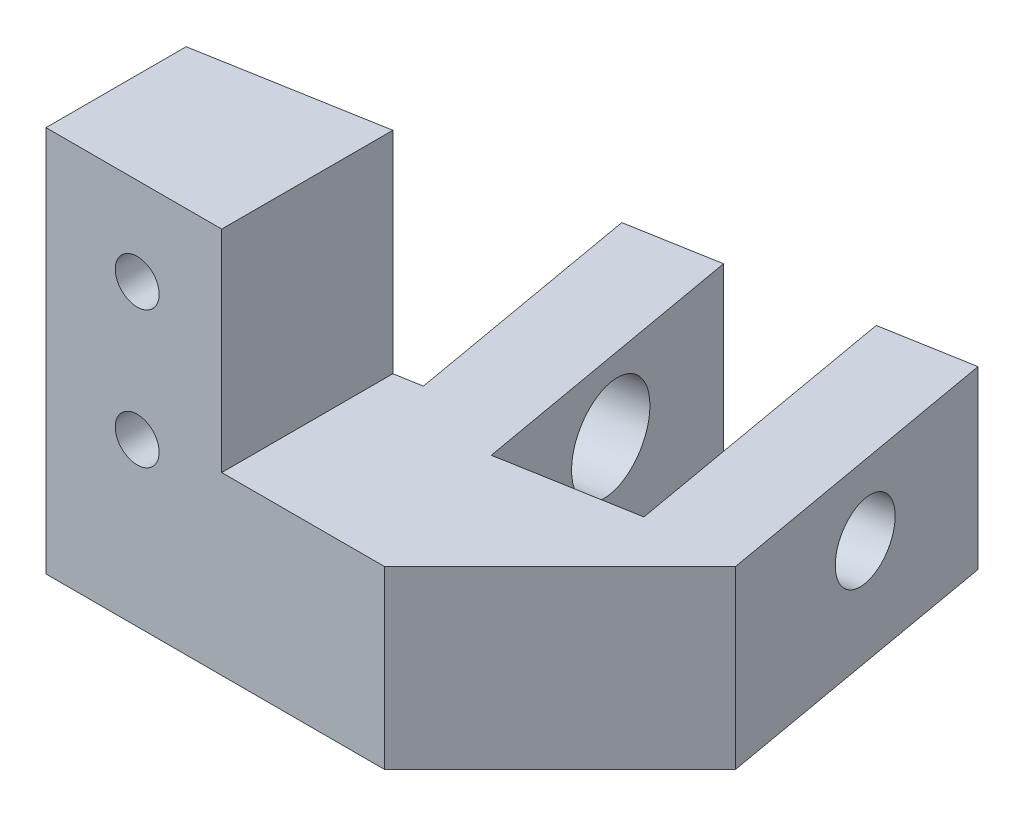
ISO-10303-21;
HEADER;
FILE_DESCRIPTION(('STEP AP214'),'2;1');
FILE_NAME('part.step','',(''),(''),'','','');
FILE_SCHEMA(('AUTOMOTIVE_DESIGN { 1 0 10303 214 1 1 1 1 }'));
ENDSEC;
DATA;
#1=APPLICATION_CONTEXT('core data for automotive mechanical design processes');
#2=APPLICATION_PROTOCOL_DEFINITION('international standard','automotive_design',2000,#1);
#3=PRODUCT_CONTEXT('',#1,'mechanical');
#4=PRODUCT('Part','Part','',(#3));
#5=PRODUCT_RELATED_PRODUCT_CATEGORY('part','',(#4));
#6=PRODUCT_DEFINITION_FORMATION('','',#4);
#7=PRODUCT_DEFINITION_CONTEXT('part definition',#1,'design');
#8=PRODUCT_DEFINITION('design','',#6,#7);
#9=PRODUCT_DEFINITION_SHAPE('','',#8);
#10=(LENGTH_UNIT() NAMED_UNIT(*) SI_UNIT(.MILLI.,.METRE.));
#11=(NAMED_UNIT(*) PLANE_ANGLE_UNIT() SI_UNIT($,.RADIAN.));
#12=(NAMED_UNIT(*) SI_UNIT($,.STERADIAN.) SOLID_ANGLE_UNIT());
#13=UNCERTAINTY_MEASURE_WITH_UNIT(LENGTH_MEASURE(1.E-05),#10,'distance_accuracy_value','');
#14=(GEOMETRIC_REPRESENTATION_CONTEXT(3) GLOBAL_UNCERTAINTY_ASSIGNED_CONTEXT((#13)) GLOBAL_UNIT_ASSIGNED_CONTEXT((#10,
#11,#12)) REPRESENTATION_CONTEXT('',''));
#15=CARTESIAN_POINT('',(0.,0.,0.));
#16=DIRECTION('',(0.,0.,1.));
#17=DIRECTION('',(1.,0.,0.));
#18=AXIS2_PLACEMENT_3D('',#15,#16,#17);
#19=CARTESIAN_POINT('',(0.,22.,10.));
#20=DIRECTION('',(1.,0.,0.));
#21=DIRECTION('',(0.,0.,-1.));
#22=AXIS2_PLACEMENT_3D('',#19,#20,#21);
#23=PLANE('',#22);
#24=DIRECTION('',(0.,0.,-1.));
#25=VECTOR('',#24,1.);
#26=CARTESIAN_POINT('',(0.,22.,10.));
#27=LINE('',#26,#25);
#28=CARTESIAN_POINT('',(0.,22.,10.));
#29=VERTEX_POINT('',#28);
#30=CARTESIAN_POINT('',(0.,22.,2.02423978513792));
#31=VERTEX_POINT('',#30);
#32=EDGE_CURVE('E157',#29,#31,#27,.T.);
#33=ORIENTED_EDGE('',*,*,#32,.T.);
#34=DIRECTION('',(0.,1.,0.));
#35=VECTOR('',#34,1.);
#36=CARTESIAN_POINT('',(0.,-0.00100000000001141,2.02423978513792));
#37=LINE('',#36,#35);
#38=CARTESIAN_POINT('',(0.,0.,2.02423978513793));
#39=VERTEX_POINT('',#38);
#40=EDGE_CURVE('E138',#39,#31,#37,.T.);
#41=ORIENTED_EDGE('',*,*,#40,.F.);
#42=DIRECTION('',(0.,0.,-1.));
#43=VECTOR('',#42,1.);
#44=CARTESIAN_POINT('',(0.,0.,10.));
#45=LINE('',#44,#43);
#46=CARTESIAN_POINT('',(0.,0.,10.));
#47=VERTEX_POINT('',#46);
#48=EDGE_CURVE('E159',#47,#39,#45,.T.);
#49=ORIENTED_EDGE('',*,*,#48,.F.);
#50=DIRECTION('',(0.,-1.,0.));
#51=VECTOR('',#50,1.);
#52=CARTESIAN_POINT('',(0.,22.,10.));
#53=LINE('',#52,#51);
#54=EDGE_CURVE('E187',#29,#47,#53,.T.);
#55=ORIENTED_EDGE('',*,*,#54,.F.);
#56=EDGE_LOOP('',(#33,#41,#49,#55));
#57=FACE_BOUND('',#56,.T.);
#58=ADVANCED_FACE('F39',(#57),#23,.F.);
#59=CARTESIAN_POINT('',(0.,0.,10.));
#60=DIRECTION('',(0.,1.,0.));
#61=DIRECTION('',(0.,0.,1.));
#62=AXIS2_PLACEMENT_3D('',#59,#60,#61);
#63=PLANE('',#62);
#64=ORIENTED_EDGE('',*,*,#48,.T.);
#65=DIRECTION('',(-0.984807753012208,0.,0.173648177666932));
#66=VECTOR('',#65,1.);
#67=CARTESIAN_POINT('',(11.4800342919995,0.,0.));
#68=LINE('',#67,#66);
#69=CARTESIAN_POINT('',(11.4800342919995,0.,0.));
#70=VERTEX_POINT('',#69);
#71=EDGE_CURVE('E251',#70,#39,#68,.T.);
#72=ORIENTED_EDGE('',*,*,#71,.F.);
#73=DIRECTION('',(-0.173648177666931,0.,-0.984807753012208));
#74=VECTOR('',#73,1.);
#75=CARTESIAN_POINT('',(9.06384530194854,0.,-13.7028886920363));
#76=LINE('',#75,#74);
#77=CARTESIAN_POINT('',(9.06384530194854,0.,-13.7028886920363));
#78=VERTEX_POINT('',#77);
#79=EDGE_CURVE('E210',#70,#78,#76,.T.);
#80=ORIENTED_EDGE('',*,*,#79,.T.);
#81=DIRECTION('',(0.984807753012208,0.,-0.173648177666931));
#82=VECTOR('',#81,1.);
#83=CARTESIAN_POINT('',(13.9878840670096,0.,-14.5711295803709));
#84=LINE('',#83,#82);
#85=CARTESIAN_POINT('',(13.9878840670096,0.,-14.5711295803709));
#86=VERTEX_POINT('',#85);
#87=EDGE_CURVE('E219',#78,#86,#84,.T.);
#88=ORIENTED_EDGE('',*,*,#87,.T.);
#89=DIRECTION('',(0.173648177666931,0.,0.984807753012208));
#90=VECTOR('',#89,1.);
#91=CARTESIAN_POINT('',(16.5571673514282,0.,0.));
#92=LINE('',#91,#90);
#93=CARTESIAN_POINT('',(16.8176396179286,0.,1.47721162951831));
#94=VERTEX_POINT('',#93);
#95=EDGE_CURVE('E185',#86,#94,#92,.T.);
#96=ORIENTED_EDGE('',*,*,#95,.T.);
#97=DIRECTION('',(-0.984807753012208,0.,0.173648177666931));
#98=VECTOR('',#97,1.);
#99=CARTESIAN_POINT('',(16.8176396179286,0.,1.47721162951831));
#100=LINE('',#99,#98);
#101=CARTESIAN_POINT('',(24.2036977655201,0.,0.174850297016328));
#102=VERTEX_POINT('',#101);
#103=EDGE_CURVE('E238',#102,#94,#100,.T.);
#104=ORIENTED_EDGE('',*,*,#103,.F.);
#105=DIRECTION('',(-0.173648177666931,0.,-0.984807753012208));
#106=VECTOR('',#105,1.);
#107=CARTESIAN_POINT('',(21.3739422146011,0.,-15.8734909128729));
#108=LINE('',#107,#106);
#109=CARTESIAN_POINT('',(21.3739422146011,0.,-15.8734909128729));
#110=VERTEX_POINT('',#109);
#111=EDGE_CURVE('E192',#102,#110,#108,.T.);
#112=ORIENTED_EDGE('',*,*,#111,.T.);
#113=DIRECTION('',(0.984807753012208,0.,-0.17364817766693));
#114=VECTOR('',#113,1.);
#115=CARTESIAN_POINT('',(26.2979809796622,0.,-16.7417318012075));
#116=LINE('',#115,#114);
#117=CARTESIAN_POINT('',(26.2979809796622,0.,-16.7417318012075));
#118=VERTEX_POINT('',#117);
#119=EDGE_CURVE('E204',#110,#118,#116,.T.);
#120=ORIENTED_EDGE('',*,*,#119,.T.);
#121=DIRECTION('',(0.173648177666931,0.,0.984807753012208));
#122=VECTOR('',#121,1.);
#123=CARTESIAN_POINT('',(29.25,0.,0.));
#124=LINE('',#123,#122);
#125=CARTESIAN_POINT('',(29.25,0.,0.));
#126=VERTEX_POINT('',#125);
#127=EDGE_CURVE('E188',#118,#126,#124,.T.);
#128=ORIENTED_EDGE('',*,*,#127,.T.);
#129=DIRECTION('',(-0.707106781186546,0.,0.707106781186549));
#130=VECTOR('',#129,1.);
#131=CARTESIAN_POINT('',(19.25,0.,10.));
#132=LINE('',#131,#130);
#133=CARTESIAN_POINT('',(19.25,0.,10.));
#134=VERTEX_POINT('',#133);
#135=EDGE_CURVE('E11',#126,#134,#132,.T.);
#136=ORIENTED_EDGE('',*,*,#135,.T.);
#137=DIRECTION('',(1.,0.,0.));
#138=VECTOR('',#137,1.);
#139=CARTESIAN_POINT('',(0.,0.,10.));
#140=LINE('',#139,#138);
#141=EDGE_CURVE('E190',#47,#134,#140,.T.);
#142=ORIENTED_EDGE('',*,*,#141,.F.);
#143=EDGE_LOOP('',(#64,#72,#80,#88,#96,#104,#112,#120,#128,#136,#142));
#144=FACE_BOUND('',#143,.T.);
#145=ADVANCED_FACE('F282',(#144),#63,.F.);
#146=CARTESIAN_POINT('',(29.25,10.,10.));
#147=DIRECTION('',(0.,-1.,0.));
#148=DIRECTION('',(1.,0.,0.));
#149=AXIS2_PLACEMENT_3D('',#146,#147,#148);
#150=PLANE('',#149);
#151=DIRECTION('',(0.173648177666931,0.,0.984807753012208));
#152=VECTOR('',#151,1.);
#153=CARTESIAN_POINT('',(9.06384530194854,10.,-13.7028886920363));
#154=LINE('',#153,#152);
#155=CARTESIAN_POINT('',(9.06384530194854,10.,-13.7028886920363));
#156=VERTEX_POINT('',#155);
#157=CARTESIAN_POINT('',(11.4800342919995,10.,0.));
#158=VERTEX_POINT('',#157);
#159=EDGE_CURVE('E214',#156,#158,#154,.T.);
#160=ORIENTED_EDGE('',*,*,#159,.T.);
#161=DIRECTION('',(0.984807753012208,0.,-0.173648177666932));
#162=VECTOR('',#161,1.);
#163=CARTESIAN_POINT('',(11.4800342919995,10.,0.));
#164=LINE('',#163,#162);
#165=CARTESIAN_POINT('',(10.,10.,0.26096997805326));
#166=VERTEX_POINT('',#165);
#167=EDGE_CURVE('E255',#166,#158,#164,.T.);
#168=ORIENTED_EDGE('',*,*,#167,.F.);
#169=DIRECTION('',(0.,0.,-1.));
#170=VECTOR('',#169,1.);
#171=CARTESIAN_POINT('',(10.,10.,10.));
#172=LINE('',#171,#170);
#173=CARTESIAN_POINT('',(10.,10.,10.));
#174=VERTEX_POINT('',#173);
#175=EDGE_CURVE('E152',#174,#166,#172,.T.);
#176=ORIENTED_EDGE('',*,*,#175,.F.);
#177=DIRECTION('',(-1.,0.,0.));
#178=VECTOR('',#177,1.);
#179=CARTESIAN_POINT('',(29.25,10.,10.));
#180=LINE('',#179,#178);
#181=CARTESIAN_POINT('',(19.25,10.,10.));
#182=VERTEX_POINT('',#181);
#183=EDGE_CURVE('E175',#182,#174,#180,.T.);
#184=ORIENTED_EDGE('',*,*,#183,.F.);
#185=DIRECTION('',(0.707106781186546,0.,-0.707106781186549));
#186=VECTOR('',#185,1.);
#187=CARTESIAN_POINT('',(19.25,10.,10.));
#188=LINE('',#187,#186);
#189=CARTESIAN_POINT('',(29.25,10.,0.));
#190=VERTEX_POINT('',#189);
#191=EDGE_CURVE('E48',#182,#190,#188,.T.);
#192=ORIENTED_EDGE('',*,*,#191,.T.);
#193=DIRECTION('',(-0.173648177666931,0.,-0.984807753012208));
#194=VECTOR('',#193,1.);
#195=CARTESIAN_POINT('',(29.25,10.,0.));
#196=LINE('',#195,#194);
#197=CARTESIAN_POINT('',(26.2979809796622,10.,-16.7417318012075));
#198=VERTEX_POINT('',#197);
#199=EDGE_CURVE('E174',#190,#198,#196,.T.);
#200=ORIENTED_EDGE('',*,*,#199,.T.);
#201=DIRECTION('',(-0.984807753012208,0.,0.17364817766693));
#202=VECTOR('',#201,1.);
#203=CARTESIAN_POINT('',(26.2979809796622,10.,-16.7417318012075));
#204=LINE('',#203,#202);
#205=CARTESIAN_POINT('',(21.3739422146011,10.,-15.8734909128729));
#206=VERTEX_POINT('',#205);
#207=EDGE_CURVE('E184',#198,#206,#204,.T.);
#208=ORIENTED_EDGE('',*,*,#207,.T.);
#209=DIRECTION('',(0.173648177666931,0.,0.984807753012208));
#210=VECTOR('',#209,1.);
#211=CARTESIAN_POINT('',(21.3739422146011,10.,-15.8734909128729));
#212=LINE('',#211,#210);
#213=CARTESIAN_POINT('',(24.2036977655201,10.,0.174850297016328));
#214=VERTEX_POINT('',#213);
#215=EDGE_CURVE('E202',#206,#214,#212,.T.);
#216=ORIENTED_EDGE('',*,*,#215,.T.);
#217=DIRECTION('',(0.984807753012208,0.,-0.173648177666931));
#218=VECTOR('',#217,1.);
#219=CARTESIAN_POINT('',(16.8176396179286,10.,1.47721162951831));
#220=LINE('',#219,#218);
#221=CARTESIAN_POINT('',(16.8176396179286,10.,1.47721162951831));
#222=VERTEX_POINT('',#221);
#223=EDGE_CURVE('E233',#222,#214,#220,.T.);
#224=ORIENTED_EDGE('',*,*,#223,.F.);
#225=DIRECTION('',(-0.173648177666931,0.,-0.984807753012208));
#226=VECTOR('',#225,1.);
#227=CARTESIAN_POINT('',(16.5571673514282,10.,0.));
#228=LINE('',#227,#226);
#229=CARTESIAN_POINT('',(13.9878840670096,10.,-14.5711295803709));
#230=VERTEX_POINT('',#229);
#231=EDGE_CURVE('E224',#222,#230,#228,.T.);
#232=ORIENTED_EDGE('',*,*,#231,.T.);
#233=DIRECTION('',(-0.984807753012208,0.,0.173648177666931));
#234=VECTOR('',#233,1.);
#235=CARTESIAN_POINT('',(13.9878840670096,10.,-14.5711295803709));
#236=LINE('',#235,#234);
#237=EDGE_CURVE('E221',#230,#156,#236,.T.);
#238=ORIENTED_EDGE('',*,*,#237,.T.);
#239=EDGE_LOOP('',(#160,#168,#176,#184,#192,#200,#208,#216,#224,#232,#238));
#240=FACE_BOUND('',#239,.T.);
#241=ADVANCED_FACE('F172',(#240),#150,.F.);
#242=CARTESIAN_POINT('',(10.,10.,10.));
#243=DIRECTION('',(-1.,0.,0.));
#244=DIRECTION('',(0.,0.,1.));
#245=AXIS2_PLACEMENT_3D('',#242,#243,#244);
#246=PLANE('',#245);
#247=ORIENTED_EDGE('',*,*,#175,.T.);
#248=DIRECTION('',(0.,-1.,0.));
#249=VECTOR('',#248,1.);
#250=CARTESIAN_POINT('',(10.,-0.00100000000000792,0.260969978053261));
#251=LINE('',#250,#249);
#252=CARTESIAN_POINT('',(10.,22.,0.26096997805326));
#253=VERTEX_POINT('',#252);
#254=EDGE_CURVE('E135',#253,#166,#251,.T.);
#255=ORIENTED_EDGE('',*,*,#254,.F.);
#256=DIRECTION('',(0.,0.,-1.));
#257=VECTOR('',#256,1.);
#258=CARTESIAN_POINT('',(10.,22.,10.));
#259=LINE('',#258,#257);
#260=CARTESIAN_POINT('',(10.,22.,10.));
#261=VERTEX_POINT('',#260);
#262=EDGE_CURVE('E149',#261,#253,#259,.T.);
#263=ORIENTED_EDGE('',*,*,#262,.F.);
#264=DIRECTION('',(0.,1.,0.));
#265=VECTOR('',#264,1.);
#266=CARTESIAN_POINT('',(10.,10.,10.));
#267=LINE('',#266,#265);
#268=EDGE_CURVE('E196',#174,#261,#267,.T.);
#269=ORIENTED_EDGE('',*,*,#268,.F.);
#270=EDGE_LOOP('',(#247,#255,#263,#269));
#271=FACE_BOUND('',#270,.T.);
#272=ADVANCED_FACE('F147',(#271),#246,.F.);
#273=CARTESIAN_POINT('',(10.,22.,10.));
#274=DIRECTION('',(0.,-1.,0.));
#275=DIRECTION('',(1.,0.,0.));
#276=AXIS2_PLACEMENT_3D('',#273,#274,#275);
#277=PLANE('',#276);
#278=ORIENTED_EDGE('',*,*,#262,.T.);
#279=DIRECTION('',(0.984807753012208,0.,-0.173648177666932));
#280=VECTOR('',#279,1.);
#281=CARTESIAN_POINT('',(11.4800342919995,22.,0.));
#282=LINE('',#281,#280);
#283=EDGE_CURVE('E132',#31,#253,#282,.T.);
#284=ORIENTED_EDGE('',*,*,#283,.F.);
#285=ORIENTED_EDGE('',*,*,#32,.F.);
#286=DIRECTION('',(-1.,0.,0.));
#287=VECTOR('',#286,1.);
#288=CARTESIAN_POINT('',(10.,22.,10.));
#289=LINE('',#288,#287);
#290=EDGE_CURVE('E156',#261,#29,#289,.T.);
#291=ORIENTED_EDGE('',*,*,#290,.F.);
#292=EDGE_LOOP('',(#278,#284,#285,#291));
#293=FACE_BOUND('',#292,.T.);
#294=ADVANCED_FACE('F155',(#293),#277,.F.);
#295=CARTESIAN_POINT('',(0.,0.,10.));
#296=DIRECTION('',(0.,0.,1.));
#297=DIRECTION('',(1.,0.,0.));
#298=AXIS2_PLACEMENT_3D('',#295,#296,#297);
#299=PLANE('',#298);
#300=CARTESIAN_POINT('',(5.19,17.,10.));
#301=DIRECTION('',(0.,0.,1.));
#302=DIRECTION('',(1.,0.,0.));
#303=AXIS2_PLACEMENT_3D('',#300,#301,#302);
#304=CIRCLE('',#303,1.25);
#305=CARTESIAN_POINT('',(6.44,17.,10.));
#306=VERTEX_POINT('',#305);
#307=EDGE_CURVE('E261',#306,#306,#304,.T.);
#308=ORIENTED_EDGE('',*,*,#307,.F.);
#309=EDGE_LOOP('',(#308));
#310=FACE_BOUND('',#309,.T.);
#311=CARTESIAN_POINT('',(5.19,9.22,10.));
#312=DIRECTION('',(0.,0.,1.));
#313=DIRECTION('',(1.,0.,0.));
#314=AXIS2_PLACEMENT_3D('',#311,#312,#313);
#315=CIRCLE('',#314,1.25);
#316=CARTESIAN_POINT('',(6.44,9.22,10.));
#317=VERTEX_POINT('',#316);
#318=EDGE_CURVE('E262',#317,#317,#315,.T.);
#319=ORIENTED_EDGE('',*,*,#318,.F.);
#320=EDGE_LOOP('',(#319));
#321=FACE_BOUND('',#320,.T.);
#322=ORIENTED_EDGE('',*,*,#141,.T.);
#323=DIRECTION('',(0.,1.,0.));
#324=VECTOR('',#323,1.);
#325=CARTESIAN_POINT('',(19.25,10.,10.));
#326=LINE('',#325,#324);
#327=EDGE_CURVE('E166',#134,#182,#326,.T.);
#328=ORIENTED_EDGE('',*,*,#327,.T.);
#329=ORIENTED_EDGE('',*,*,#183,.T.);
#330=ORIENTED_EDGE('',*,*,#268,.T.);
#331=ORIENTED_EDGE('',*,*,#290,.T.);
#332=ORIENTED_EDGE('',*,*,#54,.T.);
#333=EDGE_LOOP('',(#322,#328,#329,#330,#331,#332));
#334=FACE_BOUND('',#333,.T.);
#335=ADVANCED_FACE('F273',(#310,#321,#334),#299,.T.);
#336=CARTESIAN_POINT('',(21.3739422146011,-18.5018342318405,-15.8734909128729));
#337=DIRECTION('',(-0.984807753012208,0.,0.173648177666931));
#338=DIRECTION('',(0.173648177666931,0.,0.984807753012208));
#339=AXIS2_PLACEMENT_3D('',#336,#337,#338);
#340=PLANE('',#339);
#341=CARTESIAN_POINT('',(22.7482421386505,6.,-8.07944873890988));
#342=DIRECTION('',(-0.984807753012208,0.,0.173648177666931));
#343=DIRECTION('',(0.173648177666931,0.,0.984807753012208));
#344=AXIS2_PLACEMENT_3D('',#341,#342,#343);
#345=CIRCLE('',#344,2.1);
#346=CARTESIAN_POINT('',(23.112903311751,6.,-6.01135245758424));
#347=VERTEX_POINT('',#346);
#348=EDGE_CURVE('E245',#347,#347,#345,.T.);
#349=ORIENTED_EDGE('',*,*,#348,.F.);
#350=EDGE_LOOP('',(#349));
#351=FACE_BOUND('',#350,.T.);
#352=ORIENTED_EDGE('',*,*,#111,.F.);
#353=DIRECTION('',(0.,1.,0.));
#354=VECTOR('',#353,1.);
#355=CARTESIAN_POINT('',(24.2036977655201,-0.001000000000001,0.174850297016328));
#356=LINE('',#355,#354);
#357=EDGE_CURVE('E227',#102,#214,#356,.T.);
#358=ORIENTED_EDGE('',*,*,#357,.T.);
#359=ORIENTED_EDGE('',*,*,#215,.F.);
#360=DIRECTION('',(0.,1.,0.));
#361=VECTOR('',#360,1.);
#362=CARTESIAN_POINT('',(21.3739422146011,-18.5018342318405,-15.8734909128729));
#363=LINE('',#362,#361);
#364=EDGE_CURVE('E201',#110,#206,#363,.T.);
#365=ORIENTED_EDGE('',*,*,#364,.F.);
#366=EDGE_LOOP('',(#352,#358,#359,#365));
#367=FACE_BOUND('',#366,.T.);
#368=ADVANCED_FACE('F276',(#351,#367),#340,.T.);
#369=CARTESIAN_POINT('',(26.2979809796622,-18.5018342318405,-16.7417318012075));
#370=DIRECTION('',(-0.17364817766693,0.,-0.984807753012208));
#371=DIRECTION('',(-0.984807753012208,0.,0.17364817766693));
#372=AXIS2_PLACEMENT_3D('',#369,#370,#371);
#373=PLANE('',#372);
#374=ORIENTED_EDGE('',*,*,#119,.F.);
#375=ORIENTED_EDGE('',*,*,#364,.T.);
#376=ORIENTED_EDGE('',*,*,#207,.F.);
#377=DIRECTION('',(0.,1.,0.));
#378=VECTOR('',#377,1.);
#379=CARTESIAN_POINT('',(26.2979809796622,-18.5018342318405,-16.7417318012075));
#380=LINE('',#379,#378);
#381=EDGE_CURVE('E182',#118,#198,#380,.T.);
#382=ORIENTED_EDGE('',*,*,#381,.F.);
#383=EDGE_LOOP('',(#374,#375,#376,#382));
#384=FACE_BOUND('',#383,.T.);
#385=ADVANCED_FACE('F301',(#384),#373,.T.);
#386=CARTESIAN_POINT('',(29.25,-18.5018342318405,0.));
#387=DIRECTION('',(0.984807753012208,0.,-0.173648177666931));
#388=DIRECTION('',(-0.173648177666931,0.,-0.984807753012208));
#389=AXIS2_PLACEMENT_3D('',#386,#387,#388);
#390=PLANE('',#389);
#391=CARTESIAN_POINT('',(27.6722809037115,6.,-8.94768962724453));
#392=DIRECTION('',(0.984807753012208,0.,-0.173648177666931));
#393=DIRECTION('',(-0.173648177666931,0.,-0.984807753012208));
#394=AXIS2_PLACEMENT_3D('',#391,#392,#393);
#395=CIRCLE('',#394,2.1);
#396=CARTESIAN_POINT('',(27.307619730611,6.,-11.0157859085702));
#397=VERTEX_POINT('',#396);
#398=EDGE_CURVE('E248',#397,#397,#395,.F.);
#399=ORIENTED_EDGE('',*,*,#398,.T.);
#400=EDGE_LOOP('',(#399));
#401=FACE_BOUND('',#400,.T.);
#402=ORIENTED_EDGE('',*,*,#127,.F.);
#403=ORIENTED_EDGE('',*,*,#381,.T.);
#404=ORIENTED_EDGE('',*,*,#199,.F.);
#405=DIRECTION('',(0.,1.,0.));
#406=VECTOR('',#405,1.);
#407=CARTESIAN_POINT('',(29.25,0.,0.));
#408=LINE('',#407,#406);
#409=EDGE_CURVE('E180',#126,#190,#408,.T.);
#410=ORIENTED_EDGE('',*,*,#409,.F.);
#411=EDGE_LOOP('',(#402,#403,#404,#410));
#412=FACE_BOUND('',#411,.T.);
#413=ADVANCED_FACE('F179',(#401,#412),#390,.T.);
#414=CARTESIAN_POINT('',(9.06384530194854,-18.5018342318405,-13.7028886920363));
#415=DIRECTION('',(-0.984807753012208,0.,0.173648177666931));
#416=DIRECTION('',(0.173648177666931,0.,0.984807753012208));
#417=AXIS2_PLACEMENT_3D('',#414,#415,#416);
#418=PLANE('',#417);
#419=CARTESIAN_POINT('',(10.4381452259979,6.,-5.90884651807325));
#420=DIRECTION('',(-0.984807753012208,0.,0.173648177666931));
#421=DIRECTION('',(0.173648177666931,0.,0.984807753012208));
#422=AXIS2_PLACEMENT_3D('',#419,#420,#421);
#423=CIRCLE('',#422,2.75);
#424=CARTESIAN_POINT('',(10.9156777145819,6.,-3.20062519728968));
#425=VERTEX_POINT('',#424);
#426=EDGE_CURVE('E241',#425,#425,#423,.T.);
#427=ORIENTED_EDGE('',*,*,#426,.F.);
#428=EDGE_LOOP('',(#427));
#429=FACE_BOUND('',#428,.T.);
#430=ORIENTED_EDGE('',*,*,#79,.F.);
#431=DIRECTION('',(0.,1.,0.));
#432=VECTOR('',#431,1.);
#433=CARTESIAN_POINT('',(11.4800342919995,-18.5018342318405,0.));
#434=LINE('',#433,#432);
#435=EDGE_CURVE('E216',#70,#158,#434,.T.);
#436=ORIENTED_EDGE('',*,*,#435,.T.);
#437=ORIENTED_EDGE('',*,*,#159,.F.);
#438=DIRECTION('',(0.,1.,0.));
#439=VECTOR('',#438,1.);
#440=CARTESIAN_POINT('',(9.06384530194854,-18.5018342318405,-13.7028886920363));
#441=LINE('',#440,#439);
#442=EDGE_CURVE('E213',#78,#156,#441,.T.);
#443=ORIENTED_EDGE('',*,*,#442,.F.);
#444=EDGE_LOOP('',(#430,#436,#437,#443));
#445=FACE_BOUND('',#444,.T.);
#446=ADVANCED_FACE('F300',(#429,#445),#418,.T.);
#447=CARTESIAN_POINT('',(13.9878840670096,-18.5018342318405,-14.5711295803709));
#448=DIRECTION('',(-0.173648177666931,0.,-0.984807753012208));
#449=DIRECTION('',(-0.984807753012208,0.,0.173648177666931));
#450=AXIS2_PLACEMENT_3D('',#447,#448,#449);
#451=PLANE('',#450);
#452=ORIENTED_EDGE('',*,*,#87,.F.);
#453=ORIENTED_EDGE('',*,*,#442,.T.);
#454=ORIENTED_EDGE('',*,*,#237,.F.);
#455=DIRECTION('',(0.,1.,0.));
#456=VECTOR('',#455,1.);
#457=CARTESIAN_POINT('',(13.9878840670096,-18.5018342318405,-14.5711295803709));
#458=LINE('',#457,#456);
#459=EDGE_CURVE('E211',#86,#230,#458,.T.);
#460=ORIENTED_EDGE('',*,*,#459,.F.);
#461=EDGE_LOOP('',(#452,#453,#454,#460));
#462=FACE_BOUND('',#461,.T.);
#463=ADVANCED_FACE('F313',(#462),#451,.T.);
#464=CARTESIAN_POINT('',(16.5571673514282,-18.5018342318405,0.));
#465=DIRECTION('',(0.984807753012208,0.,-0.173648177666931));
#466=DIRECTION('',(-0.173648177666931,0.,-0.984807753012208));
#467=AXIS2_PLACEMENT_3D('',#464,#465,#466);
#468=PLANE('',#467);
#469=CARTESIAN_POINT('',(15.3621839910589,6.,-6.7770874064079));
#470=DIRECTION('',(0.984807753012208,0.,-0.173648177666931));
#471=DIRECTION('',(-0.173648177666931,0.,-0.984807753012208));
#472=AXIS2_PLACEMENT_3D('',#469,#470,#471);
#473=CIRCLE('',#472,2.75);
#474=CARTESIAN_POINT('',(14.8846515024749,6.,-9.48530872719147));
#475=VERTEX_POINT('',#474);
#476=EDGE_CURVE('E242',#475,#475,#473,.F.);
#477=ORIENTED_EDGE('',*,*,#476,.T.);
#478=EDGE_LOOP('',(#477));
#479=FACE_BOUND('',#478,.T.);
#480=ORIENTED_EDGE('',*,*,#95,.F.);
#481=ORIENTED_EDGE('',*,*,#459,.T.);
#482=ORIENTED_EDGE('',*,*,#231,.F.);
#483=DIRECTION('',(0.,1.,0.));
#484=VECTOR('',#483,1.);
#485=CARTESIAN_POINT('',(16.8176396179286,-0.00100000000000273,1.47721162951831));
#486=LINE('',#485,#484);
#487=EDGE_CURVE('E230',#94,#222,#486,.T.);
#488=ORIENTED_EDGE('',*,*,#487,.F.);
#489=EDGE_LOOP('',(#480,#481,#482,#488));
#490=FACE_BOUND('',#489,.T.);
#491=ADVANCED_FACE('F309',(#479,#490),#468,.T.);
#492=CARTESIAN_POINT('',(16.8176396179286,-0.00100000000000273,1.47721162951831));
#493=DIRECTION('',(0.173648177666931,0.,0.984807753012208));
#494=DIRECTION('',(0.984807753012208,0.,-0.173648177666931));
#495=AXIS2_PLACEMENT_3D('',#492,#493,#494);
#496=PLANE('',#495);
#497=ORIENTED_EDGE('',*,*,#103,.T.);
#498=ORIENTED_EDGE('',*,*,#487,.T.);
#499=ORIENTED_EDGE('',*,*,#223,.T.);
#500=ORIENTED_EDGE('',*,*,#357,.F.);
#501=EDGE_LOOP('',(#497,#498,#499,#500));
#502=FACE_BOUND('',#501,.T.);
#503=ADVANCED_FACE('F312',(#502),#496,.F.);
#504=CARTESIAN_POINT('',(30.536426515178,6.,-9.45271577522383));
#505=DIRECTION('',(-0.984807753012208,0.,0.173648177666931));
#506=DIRECTION('',(0.173648177666931,0.,0.984807753012208));
#507=AXIS2_PLACEMENT_3D('',#504,#505,#506);
#508=CYLINDRICAL_SURFACE('',#507,2.75);
#509=ORIENTED_EDGE('',*,*,#476,.F.);
#510=EDGE_LOOP('',(#509));
#511=FACE_BOUND('',#510,.T.);
#512=ORIENTED_EDGE('',*,*,#426,.T.);
#513=EDGE_LOOP('',(#512));
#514=FACE_BOUND('',#513,.T.);
#515=ADVANCED_FACE('F323',(#511,#514),#508,.F.);
#516=CARTESIAN_POINT('',(30.536426515178,6.,-9.45271577522382));
#517=DIRECTION('',(-0.984807753012208,0.,0.173648177666931));
#518=DIRECTION('',(0.173648177666931,0.,0.984807753012208));
#519=AXIS2_PLACEMENT_3D('',#516,#517,#518);
#520=CYLINDRICAL_SURFACE('',#519,2.1);
#521=ORIENTED_EDGE('',*,*,#398,.F.);
#522=EDGE_LOOP('',(#521));
#523=FACE_BOUND('',#522,.T.);
#524=ORIENTED_EDGE('',*,*,#348,.T.);
#525=EDGE_LOOP('',(#524));
#526=FACE_BOUND('',#525,.T.);
#527=ADVANCED_FACE('F327',(#523,#526),#520,.F.);
#528=CARTESIAN_POINT('',(19.25,0.,10.));
#529=DIRECTION('',(0.707106781186549,0.,0.707106781186546));
#530=DIRECTION('',(0.,-1.,0.));
#531=AXIS2_PLACEMENT_3D('',#528,#529,#530);
#532=PLANE('',#531);
#533=ORIENTED_EDGE('',*,*,#135,.F.);
#534=ORIENTED_EDGE('',*,*,#409,.T.);
#535=ORIENTED_EDGE('',*,*,#191,.F.);
#536=ORIENTED_EDGE('',*,*,#327,.F.);
#537=EDGE_LOOP('',(#533,#534,#535,#536));
#538=FACE_BOUND('',#537,.T.);
#539=ADVANCED_FACE('F42',(#538),#532,.T.);
#540=CARTESIAN_POINT('',(11.4800342919995,-0.00100000000000794,0.));
#541=DIRECTION('',(0.173648177666932,0.,0.984807753012208));
#542=DIRECTION('',(0.984807753012208,0.,-0.173648177666932));
#543=AXIS2_PLACEMENT_3D('',#540,#541,#542);
#544=PLANE('',#543);
#545=CARTESIAN_POINT('',(5.19,17.,1.10910275526098));
#546=DIRECTION('',(0.173648177666932,0.,0.984807753012208));
#547=DIRECTION('',(-0.984807753012208,0.,0.173648177666932));
#548=AXIS2_PLACEMENT_3D('',#545,#546,#547);
#549=ELLIPSE('',#548,1.26928326485718,1.25);
#550=CARTESIAN_POINT('',(3.94,17.,1.32951148114657));
#551=VERTEX_POINT('',#550);
#552=EDGE_CURVE('E153',#551,#551,#549,.F.);
#553=ORIENTED_EDGE('',*,*,#552,.F.);
#554=EDGE_LOOP('',(#553));
#555=FACE_BOUND('',#554,.T.);
#556=CARTESIAN_POINT('',(5.19,9.22,1.10910275526098));
#557=DIRECTION('',(0.173648177666932,0.,0.984807753012208));
#558=DIRECTION('',(-0.984807753012208,0.,0.173648177666932));
#559=AXIS2_PLACEMENT_3D('',#556,#557,#558);
#560=ELLIPSE('',#559,1.26928326485718,1.25);
#561=CARTESIAN_POINT('',(3.94,9.22,1.32951148114657));
#562=VERTEX_POINT('',#561);
#563=EDGE_CURVE('E258',#562,#562,#560,.F.);
#564=ORIENTED_EDGE('',*,*,#563,.F.);
#565=EDGE_LOOP('',(#564));
#566=FACE_BOUND('',#565,.T.);
#567=ORIENTED_EDGE('',*,*,#71,.T.);
#568=ORIENTED_EDGE('',*,*,#40,.T.);
#569=ORIENTED_EDGE('',*,*,#283,.T.);
#570=ORIENTED_EDGE('',*,*,#254,.T.);
#571=ORIENTED_EDGE('',*,*,#167,.T.);
#572=ORIENTED_EDGE('',*,*,#435,.F.);
#573=EDGE_LOOP('',(#567,#568,#569,#570,#571,#572));
#574=FACE_BOUND('',#573,.T.);
#575=ADVANCED_FACE('F134',(#555,#566,#574),#544,.F.);
#576=CARTESIAN_POINT('',(5.19,9.22,-16.7427318012075));
#577=DIRECTION('',(0.,0.,1.));
#578=DIRECTION('',(1.,0.,0.));
#579=AXIS2_PLACEMENT_3D('',#576,#577,#578);
#580=CYLINDRICAL_SURFACE('',#579,1.25);
#581=ORIENTED_EDGE('',*,*,#318,.T.);
#582=EDGE_LOOP('',(#581));
#583=FACE_BOUND('',#582,.T.);
#584=ORIENTED_EDGE('',*,*,#563,.T.);
#585=EDGE_LOOP('',(#584));
#586=FACE_BOUND('',#585,.T.);
#587=ADVANCED_FACE('F334',(#583,#586),#580,.F.);
#588=CARTESIAN_POINT('',(5.19,17.,-16.7427318012075));
#589=DIRECTION('',(0.,0.,1.));
#590=DIRECTION('',(1.,0.,0.));
#591=AXIS2_PLACEMENT_3D('',#588,#589,#590);
#592=CYLINDRICAL_SURFACE('',#591,1.25);
#593=ORIENTED_EDGE('',*,*,#307,.T.);
#594=EDGE_LOOP('',(#593));
#595=FACE_BOUND('',#594,.T.);
#596=ORIENTED_EDGE('',*,*,#552,.T.);
#597=EDGE_LOOP('',(#596));
#598=FACE_BOUND('',#597,.T.);
#599=ADVANCED_FACE('F270',(#595,#598),#592,.F.);
#600=CLOSED_SHELL('',(#58,#145,#241,#272,#294,#335,#368,#385,#413,#446,#463,#491,#503,#515,#527,
#539,#575,#587,#599));
#601=MANIFOLD_SOLID_BREP('B2',#600);
#602=ADVANCED_BREP_SHAPE_REPRESENTATION('',(#18,#601),#14);
#603=SHAPE_DEFINITION_REPRESENTATION(#9,#602);
ENDSEC;
END-ISO-10303-21;
